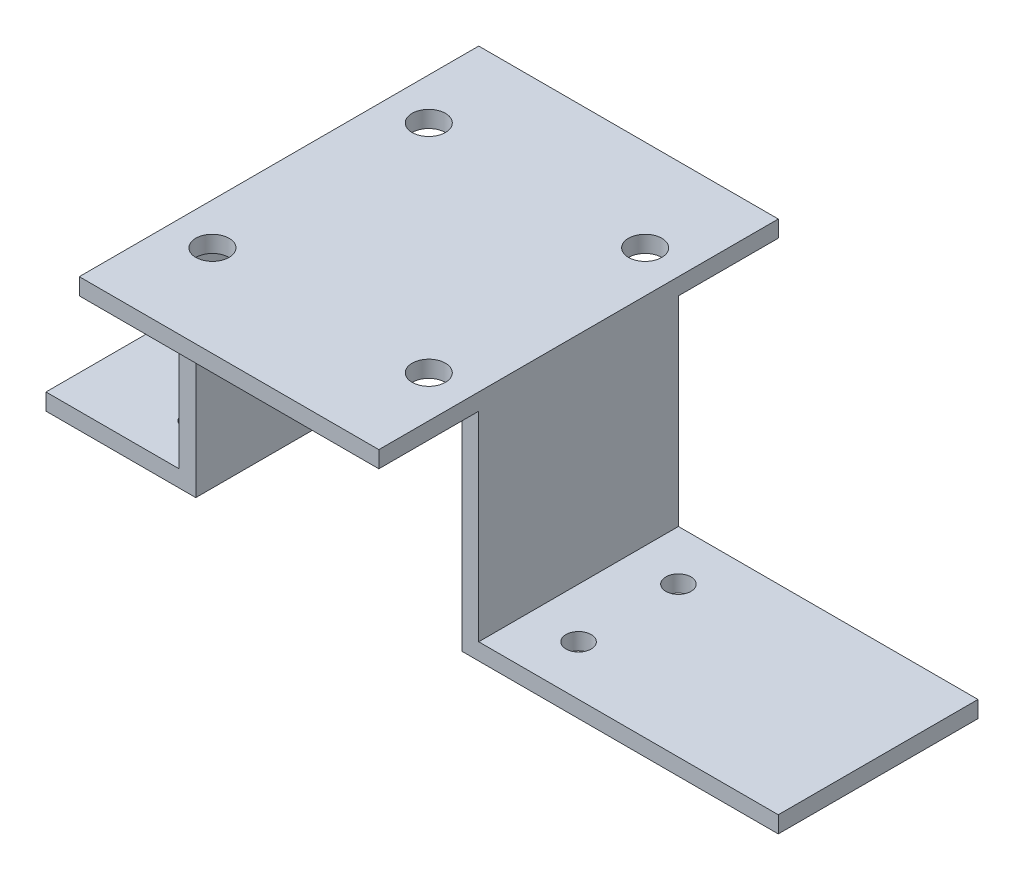
ISO-10303-21;
HEADER;
FILE_DESCRIPTION(('STEP AP214'),'2;1');
FILE_NAME('part.step','',(''),(''),'','','');
FILE_SCHEMA(('AUTOMOTIVE_DESIGN { 1 0 10303 214 1 1 1 1 }'));
ENDSEC;
DATA;
#1=APPLICATION_CONTEXT('core data for automotive mechanical design processes');
#2=APPLICATION_PROTOCOL_DEFINITION('international standard','automotive_design',2000,#1);
#3=PRODUCT_CONTEXT('',#1,'mechanical');
#4=PRODUCT('Part','Part','',(#3));
#5=PRODUCT_RELATED_PRODUCT_CATEGORY('part','',(#4));
#6=PRODUCT_DEFINITION_FORMATION('','',#4);
#7=PRODUCT_DEFINITION_CONTEXT('part definition',#1,'design');
#8=PRODUCT_DEFINITION('design','',#6,#7);
#9=PRODUCT_DEFINITION_SHAPE('','',#8);
#10=(LENGTH_UNIT() NAMED_UNIT(*) SI_UNIT(.MILLI.,.METRE.));
#11=(NAMED_UNIT(*) PLANE_ANGLE_UNIT() SI_UNIT($,.RADIAN.));
#12=(NAMED_UNIT(*) SI_UNIT($,.STERADIAN.) SOLID_ANGLE_UNIT());
#13=UNCERTAINTY_MEASURE_WITH_UNIT(LENGTH_MEASURE(1.E-05),#10,'distance_accuracy_value','');
#14=(GEOMETRIC_REPRESENTATION_CONTEXT(3) GLOBAL_UNCERTAINTY_ASSIGNED_CONTEXT((#13)) GLOBAL_UNIT_ASSIGNED_CONTEXT((#10,
#11,#12)) REPRESENTATION_CONTEXT('',''));
#15=CARTESIAN_POINT('',(0.,0.,0.));
#16=DIRECTION('',(0.,0.,1.));
#17=DIRECTION('',(1.,0.,0.));
#18=AXIS2_PLACEMENT_3D('',#15,#16,#17);
#19=CARTESIAN_POINT('',(19.05,-15.875,28.575));
#20=DIRECTION('',(0.,1.,0.));
#21=DIRECTION('',(-1.,0.,0.));
#22=AXIS2_PLACEMENT_3D('',#19,#20,#21);
#23=CYLINDRICAL_SURFACE('',#22,2.4003);
#24=CARTESIAN_POINT('',(19.05,0.,28.575));
#25=DIRECTION('',(0.,1.,0.));
#26=DIRECTION('',(-1.,0.,0.));
#27=AXIS2_PLACEMENT_3D('',#24,#25,#26);
#28=CIRCLE('',#27,2.4003);
#29=CARTESIAN_POINT('',(16.6497,0.,28.575));
#30=VERTEX_POINT('',#29);
#31=EDGE_CURVE('E19',#30,#30,#28,.F.);
#32=ORIENTED_EDGE('',*,*,#31,.T.);
#33=EDGE_LOOP('',(#32));
#34=FACE_BOUND('',#33,.T.);
#35=CARTESIAN_POINT('',(19.05,3.175,28.575));
#36=DIRECTION('',(0.,1.,0.));
#37=DIRECTION('',(-1.,0.,0.));
#38=AXIS2_PLACEMENT_3D('',#35,#36,#37);
#39=CIRCLE('',#38,2.4003);
#40=CARTESIAN_POINT('',(16.6497,3.175,28.575));
#41=VERTEX_POINT('',#40);
#42=EDGE_CURVE('E147',#41,#41,#39,.T.);
#43=ORIENTED_EDGE('',*,*,#42,.T.);
#44=EDGE_LOOP('',(#43));
#45=FACE_BOUND('',#44,.T.);
#46=ADVANCED_FACE('F16',(#34,#45),#23,.F.);
#47=CARTESIAN_POINT('',(19.05,-15.875,9.525));
#48=DIRECTION('',(0.,1.,0.));
#49=DIRECTION('',(-1.,0.,0.));
#50=AXIS2_PLACEMENT_3D('',#47,#48,#49);
#51=CYLINDRICAL_SURFACE('',#50,2.4003);
#52=CARTESIAN_POINT('',(19.05,0.,9.525));
#53=DIRECTION('',(0.,1.,0.));
#54=DIRECTION('',(-1.,0.,0.));
#55=AXIS2_PLACEMENT_3D('',#52,#53,#54);
#56=CIRCLE('',#55,2.4003);
#57=CARTESIAN_POINT('',(16.6497,0.,9.525));
#58=VERTEX_POINT('',#57);
#59=EDGE_CURVE('E164',#58,#58,#56,.F.);
#60=ORIENTED_EDGE('',*,*,#59,.T.);
#61=EDGE_LOOP('',(#60));
#62=FACE_BOUND('',#61,.T.);
#63=CARTESIAN_POINT('',(19.05,3.175,9.525));
#64=DIRECTION('',(0.,1.,0.));
#65=DIRECTION('',(-1.,0.,0.));
#66=AXIS2_PLACEMENT_3D('',#63,#64,#65);
#67=CIRCLE('',#66,2.4003);
#68=CARTESIAN_POINT('',(16.6497,3.175,9.525));
#69=VERTEX_POINT('',#68);
#70=EDGE_CURVE('E201',#69,#69,#67,.T.);
#71=ORIENTED_EDGE('',*,*,#70,.T.);
#72=EDGE_LOOP('',(#71));
#73=FACE_BOUND('',#72,.T.);
#74=ADVANCED_FACE('F230',(#62,#73),#51,.F.);
#75=CARTESIAN_POINT('',(0.,0.,38.1));
#76=DIRECTION('',(1.,0.,0.));
#77=DIRECTION('',(0.,1.,0.));
#78=AXIS2_PLACEMENT_3D('',#75,#76,#77);
#79=PLANE('',#78);
#80=DIRECTION('',(0.,0.,1.));
#81=VECTOR('',#80,1.);
#82=CARTESIAN_POINT('',(0.,0.,38.1));
#83=LINE('',#82,#81);
#84=CARTESIAN_POINT('',(0.,0.,0.));
#85=VERTEX_POINT('',#84);
#86=CARTESIAN_POINT('',(0.,0.,38.1));
#87=VERTEX_POINT('',#86);
#88=EDGE_CURVE('E142',#85,#87,#83,.T.);
#89=ORIENTED_EDGE('',*,*,#88,.T.);
#90=DIRECTION('',(0.,1.,0.));
#91=VECTOR('',#90,1.);
#92=CARTESIAN_POINT('',(0.,0.,38.1));
#93=LINE('',#92,#91);
#94=CARTESIAN_POINT('',(0.,3.175,38.1));
#95=VERTEX_POINT('',#94);
#96=EDGE_CURVE('E126',#95,#87,#93,.F.);
#97=ORIENTED_EDGE('',*,*,#96,.F.);
#98=DIRECTION('',(0.,0.,1.));
#99=VECTOR('',#98,1.);
#100=CARTESIAN_POINT('',(0.,3.175,38.1));
#101=LINE('',#100,#99);
#102=CARTESIAN_POINT('',(0.,3.175,0.));
#103=VERTEX_POINT('',#102);
#104=EDGE_CURVE('E523',#95,#103,#101,.F.);
#105=ORIENTED_EDGE('',*,*,#104,.T.);
#106=DIRECTION('',(0.,1.,0.));
#107=VECTOR('',#106,1.);
#108=CARTESIAN_POINT('',(0.,0.,0.));
#109=LINE('',#108,#107);
#110=EDGE_CURVE('E517',#103,#85,#109,.F.);
#111=ORIENTED_EDGE('',*,*,#110,.T.);
#112=EDGE_LOOP('',(#89,#97,#105,#111));
#113=FACE_BOUND('',#112,.T.);
#114=ADVANCED_FACE('F220',(#113),#79,.F.);
#115=CARTESIAN_POINT('',(0.,0.,38.1));
#116=DIRECTION('',(0.,1.,0.));
#117=DIRECTION('',(0.,0.,1.));
#118=AXIS2_PLACEMENT_3D('',#115,#116,#117);
#119=PLANE('',#118);
#120=DIRECTION('',(0.,0.,1.));
#121=VECTOR('',#120,1.);
#122=CARTESIAN_POINT('',(28.575,0.,38.1));
#123=LINE('',#122,#121);
#124=CARTESIAN_POINT('',(28.575,0.,0.));
#125=VERTEX_POINT('',#124);
#126=CARTESIAN_POINT('',(28.575,0.,38.1));
#127=VERTEX_POINT('',#126);
#128=EDGE_CURVE('E132',#125,#127,#123,.T.);
#129=ORIENTED_EDGE('',*,*,#128,.T.);
#130=DIRECTION('',(1.,0.,0.));
#131=VECTOR('',#130,1.);
#132=CARTESIAN_POINT('',(0.,0.,38.1));
#133=LINE('',#132,#131);
#134=EDGE_CURVE('E135',#87,#127,#133,.T.);
#135=ORIENTED_EDGE('',*,*,#134,.F.);
#136=ORIENTED_EDGE('',*,*,#88,.F.);
#137=DIRECTION('',(1.,0.,0.));
#138=VECTOR('',#137,1.);
#139=CARTESIAN_POINT('',(0.,0.,0.));
#140=LINE('',#139,#138);
#141=EDGE_CURVE('E137',#85,#125,#140,.T.);
#142=ORIENTED_EDGE('',*,*,#141,.T.);
#143=EDGE_LOOP('',(#129,#135,#136,#142));
#144=FACE_BOUND('',#143,.T.);
#145=ORIENTED_EDGE('',*,*,#59,.F.);
#146=EDGE_LOOP('',(#145));
#147=FACE_BOUND('',#146,.T.);
#148=ORIENTED_EDGE('',*,*,#31,.F.);
#149=EDGE_LOOP('',(#148));
#150=FACE_BOUND('',#149,.T.);
#151=ADVANCED_FACE('F133',(#144,#147,#150),#119,.F.);
#152=CARTESIAN_POINT('',(92.075,-15.875,28.575));
#153=DIRECTION('',(0.,1.,0.));
#154=DIRECTION('',(-1.,0.,0.));
#155=AXIS2_PLACEMENT_3D('',#152,#153,#154);
#156=CYLINDRICAL_SURFACE('',#155,2.40029999999999);
#157=CARTESIAN_POINT('',(92.075,0.,28.575));
#158=DIRECTION('',(0.,1.,0.));
#159=DIRECTION('',(-1.,0.,0.));
#160=AXIS2_PLACEMENT_3D('',#157,#158,#159);
#161=CIRCLE('',#160,2.40029999999999);
#162=CARTESIAN_POINT('',(89.6747,0.,28.575));
#163=VERTEX_POINT('',#162);
#164=EDGE_CURVE('E141',#163,#163,#161,.F.);
#165=ORIENTED_EDGE('',*,*,#164,.T.);
#166=EDGE_LOOP('',(#165));
#167=FACE_BOUND('',#166,.T.);
#168=CARTESIAN_POINT('',(92.075,3.17500000000001,28.575));
#169=DIRECTION('',(0.,1.,0.));
#170=DIRECTION('',(-1.,0.,0.));
#171=AXIS2_PLACEMENT_3D('',#168,#169,#170);
#172=CIRCLE('',#171,2.40029999999999);
#173=CARTESIAN_POINT('',(89.6747,3.17500000000001,28.575));
#174=VERTEX_POINT('',#173);
#175=EDGE_CURVE('E197',#174,#174,#172,.T.);
#176=ORIENTED_EDGE('',*,*,#175,.T.);
#177=EDGE_LOOP('',(#176));
#178=FACE_BOUND('',#177,.T.);
#179=ADVANCED_FACE('F219',(#167,#178),#156,.F.);
#180=CARTESIAN_POINT('',(92.075,-15.875,9.525));
#181=DIRECTION('',(0.,1.,0.));
#182=DIRECTION('',(-1.,0.,0.));
#183=AXIS2_PLACEMENT_3D('',#180,#181,#182);
#184=CYLINDRICAL_SURFACE('',#183,2.40029999999999);
#185=CARTESIAN_POINT('',(92.075,0.,9.525));
#186=DIRECTION('',(0.,1.,0.));
#187=DIRECTION('',(-1.,0.,0.));
#188=AXIS2_PLACEMENT_3D('',#185,#186,#187);
#189=CIRCLE('',#188,2.40029999999999);
#190=CARTESIAN_POINT('',(89.6747,0.,9.525));
#191=VERTEX_POINT('',#190);
#192=EDGE_CURVE('E161',#191,#191,#189,.F.);
#193=ORIENTED_EDGE('',*,*,#192,.T.);
#194=EDGE_LOOP('',(#193));
#195=FACE_BOUND('',#194,.T.);
#196=CARTESIAN_POINT('',(92.075,3.17500000000001,9.525));
#197=DIRECTION('',(0.,1.,0.));
#198=DIRECTION('',(-1.,0.,0.));
#199=AXIS2_PLACEMENT_3D('',#196,#197,#198);
#200=CIRCLE('',#199,2.40029999999999);
#201=CARTESIAN_POINT('',(89.6747,3.17500000000001,9.525));
#202=VERTEX_POINT('',#201);
#203=EDGE_CURVE('E193',#202,#202,#200,.T.);
#204=ORIENTED_EDGE('',*,*,#203,.T.);
#205=EDGE_LOOP('',(#204));
#206=FACE_BOUND('',#205,.T.);
#207=ADVANCED_FACE('F227',(#195,#206),#184,.F.);
#208=CARTESIAN_POINT('',(28.575,0.,38.1));
#209=DIRECTION('',(-1.,0.,0.));
#210=DIRECTION('',(0.,0.,1.));
#211=AXIS2_PLACEMENT_3D('',#208,#209,#210);
#212=PLANE('',#211);
#213=DIRECTION('',(0.,0.,1.));
#214=VECTOR('',#213,1.);
#215=CARTESIAN_POINT('',(28.575,41.275,57.15));
#216=LINE('',#215,#214);
#217=CARTESIAN_POINT('',(28.575,41.275,0.));
#218=VERTEX_POINT('',#217);
#219=CARTESIAN_POINT('',(28.575,41.275,38.1));
#220=VERTEX_POINT('',#219);
#221=EDGE_CURVE('E152',#218,#220,#216,.T.);
#222=ORIENTED_EDGE('',*,*,#221,.T.);
#223=DIRECTION('',(0.,1.,0.));
#224=VECTOR('',#223,1.);
#225=CARTESIAN_POINT('',(28.575,0.,38.1));
#226=LINE('',#225,#224);
#227=EDGE_CURVE('E145',#127,#220,#226,.T.);
#228=ORIENTED_EDGE('',*,*,#227,.F.);
#229=ORIENTED_EDGE('',*,*,#128,.F.);
#230=DIRECTION('',(0.,1.,0.));
#231=VECTOR('',#230,1.);
#232=CARTESIAN_POINT('',(28.575,0.,0.));
#233=LINE('',#232,#231);
#234=EDGE_CURVE('E200',#125,#218,#233,.T.);
#235=ORIENTED_EDGE('',*,*,#234,.T.);
#236=EDGE_LOOP('',(#222,#228,#229,#235));
#237=FACE_BOUND('',#236,.T.);
#238=ADVANCED_FACE('F150',(#237),#212,.F.);
#239=CARTESIAN_POINT('',(79.375,0.,38.1));
#240=DIRECTION('',(1.,0.,0.));
#241=DIRECTION('',(0.,1.,0.));
#242=AXIS2_PLACEMENT_3D('',#239,#240,#241);
#243=PLANE('',#242);
#244=DIRECTION('',(0.,0.,1.));
#245=VECTOR('',#244,1.);
#246=CARTESIAN_POINT('',(79.375,0.,38.1));
#247=LINE('',#246,#245);
#248=CARTESIAN_POINT('',(79.375,0.,0.));
#249=VERTEX_POINT('',#248);
#250=CARTESIAN_POINT('',(79.375,0.,38.1));
#251=VERTEX_POINT('',#250);
#252=EDGE_CURVE('E157',#249,#251,#247,.T.);
#253=ORIENTED_EDGE('',*,*,#252,.T.);
#254=DIRECTION('',(0.,1.,0.));
#255=VECTOR('',#254,1.);
#256=CARTESIAN_POINT('',(79.375,0.,38.1));
#257=LINE('',#256,#255);
#258=CARTESIAN_POINT('',(79.375,41.275,38.1));
#259=VERTEX_POINT('',#258);
#260=EDGE_CURVE('E499',#259,#251,#257,.F.);
#261=ORIENTED_EDGE('',*,*,#260,.F.);
#262=DIRECTION('',(0.,0.,1.));
#263=VECTOR('',#262,1.);
#264=CARTESIAN_POINT('',(79.375,41.275,57.15));
#265=LINE('',#264,#263);
#266=CARTESIAN_POINT('',(79.375,41.275,0.));
#267=VERTEX_POINT('',#266);
#268=EDGE_CURVE('E562',#259,#267,#265,.F.);
#269=ORIENTED_EDGE('',*,*,#268,.T.);
#270=DIRECTION('',(0.,1.,0.));
#271=VECTOR('',#270,1.);
#272=CARTESIAN_POINT('',(79.375,0.,0.));
#273=LINE('',#272,#271);
#274=EDGE_CURVE('E501',#267,#249,#273,.F.);
#275=ORIENTED_EDGE('',*,*,#274,.T.);
#276=EDGE_LOOP('',(#253,#261,#269,#275));
#277=FACE_BOUND('',#276,.T.);
#278=ADVANCED_FACE('F306',(#277),#243,.F.);
#279=CARTESIAN_POINT('',(0.,0.,38.1));
#280=DIRECTION('',(0.,1.,0.));
#281=DIRECTION('',(0.,0.,1.));
#282=AXIS2_PLACEMENT_3D('',#279,#280,#281);
#283=PLANE('',#282);
#284=DIRECTION('',(0.,0.,1.));
#285=VECTOR('',#284,1.);
#286=CARTESIAN_POINT('',(139.7,0.,38.1));
#287=LINE('',#286,#285);
#288=CARTESIAN_POINT('',(139.7,0.,0.));
#289=VERTEX_POINT('',#288);
#290=CARTESIAN_POINT('',(139.7,0.,38.1));
#291=VERTEX_POINT('',#290);
#292=EDGE_CURVE('E153',#289,#291,#287,.T.);
#293=ORIENTED_EDGE('',*,*,#292,.T.);
#294=DIRECTION('',(1.,0.,0.));
#295=VECTOR('',#294,1.);
#296=CARTESIAN_POINT('',(0.,0.,38.1));
#297=LINE('',#296,#295);
#298=EDGE_CURVE('E504',#251,#291,#297,.T.);
#299=ORIENTED_EDGE('',*,*,#298,.F.);
#300=ORIENTED_EDGE('',*,*,#252,.F.);
#301=DIRECTION('',(1.,0.,0.));
#302=VECTOR('',#301,1.);
#303=CARTESIAN_POINT('',(0.,0.,0.));
#304=LINE('',#303,#302);
#305=EDGE_CURVE('E559',#249,#289,#304,.T.);
#306=ORIENTED_EDGE('',*,*,#305,.T.);
#307=EDGE_LOOP('',(#293,#299,#300,#306));
#308=FACE_BOUND('',#307,.T.);
#309=ORIENTED_EDGE('',*,*,#192,.F.);
#310=EDGE_LOOP('',(#309));
#311=FACE_BOUND('',#310,.T.);
#312=ORIENTED_EDGE('',*,*,#164,.F.);
#313=EDGE_LOOP('',(#312));
#314=FACE_BOUND('',#313,.T.);
#315=ADVANCED_FACE('F302',(#308,#311,#314),#283,.F.);
#316=CARTESIAN_POINT('',(139.7,0.,38.1));
#317=DIRECTION('',(-1.,0.,0.));
#318=DIRECTION('',(0.,0.,1.));
#319=AXIS2_PLACEMENT_3D('',#316,#317,#318);
#320=PLANE('',#319);
#321=DIRECTION('',(0.,0.,1.));
#322=VECTOR('',#321,1.);
#323=CARTESIAN_POINT('',(139.7,3.175,38.1));
#324=LINE('',#323,#322);
#325=CARTESIAN_POINT('',(139.7,3.175,0.));
#326=VERTEX_POINT('',#325);
#327=CARTESIAN_POINT('',(139.7,3.175,38.1));
#328=VERTEX_POINT('',#327);
#329=EDGE_CURVE('E196',#326,#328,#324,.T.);
#330=ORIENTED_EDGE('',*,*,#329,.T.);
#331=DIRECTION('',(0.,1.,0.));
#332=VECTOR('',#331,1.);
#333=CARTESIAN_POINT('',(139.7,0.,38.1));
#334=LINE('',#333,#332);
#335=EDGE_CURVE('E506',#291,#328,#334,.T.);
#336=ORIENTED_EDGE('',*,*,#335,.F.);
#337=ORIENTED_EDGE('',*,*,#292,.F.);
#338=DIRECTION('',(0.,1.,0.));
#339=VECTOR('',#338,1.);
#340=CARTESIAN_POINT('',(139.7,0.,0.));
#341=LINE('',#340,#339);
#342=EDGE_CURVE('E556',#289,#326,#341,.T.);
#343=ORIENTED_EDGE('',*,*,#342,.T.);
#344=EDGE_LOOP('',(#330,#336,#337,#343));
#345=FACE_BOUND('',#344,.T.);
#346=ADVANCED_FACE('F299',(#345),#320,.F.);
#347=CARTESIAN_POINT('',(0.,0.,38.1));
#348=DIRECTION('',(0.,0.,1.));
#349=DIRECTION('',(1.,0.,0.));
#350=AXIS2_PLACEMENT_3D('',#347,#348,#349);
#351=PLANE('',#350);
#352=ORIENTED_EDGE('',*,*,#96,.T.);
#353=ORIENTED_EDGE('',*,*,#134,.T.);
#354=ORIENTED_EDGE('',*,*,#227,.T.);
#355=DIRECTION('',(-1.,0.,0.));
#356=VECTOR('',#355,1.);
#357=CARTESIAN_POINT('',(0.,41.275,38.1));
#358=LINE('',#357,#356);
#359=CARTESIAN_POINT('',(25.4,41.275,38.1));
#360=VERTEX_POINT('',#359);
#361=EDGE_CURVE('E567',#220,#360,#358,.T.);
#362=ORIENTED_EDGE('',*,*,#361,.T.);
#363=DIRECTION('',(0.,1.,0.));
#364=VECTOR('',#363,1.);
#365=CARTESIAN_POINT('',(25.4,0.,38.1));
#366=LINE('',#365,#364);
#367=CARTESIAN_POINT('',(25.4,3.175,38.1));
#368=VERTEX_POINT('',#367);
#369=EDGE_CURVE('E527',#360,#368,#366,.F.);
#370=ORIENTED_EDGE('',*,*,#369,.T.);
#371=DIRECTION('',(1.,0.,0.));
#372=VECTOR('',#371,1.);
#373=CARTESIAN_POINT('',(0.,3.175,38.1));
#374=LINE('',#373,#372);
#375=EDGE_CURVE('E204',#368,#95,#374,.F.);
#376=ORIENTED_EDGE('',*,*,#375,.T.);
#377=EDGE_LOOP('',(#352,#353,#354,#362,#370,#376));
#378=FACE_BOUND('',#377,.T.);
#379=ADVANCED_FACE('F144',(#378),#351,.T.);
#380=CARTESIAN_POINT('',(0.,3.175,38.1));
#381=DIRECTION('',(0.,-1.,0.));
#382=DIRECTION('',(1.,0.,0.));
#383=AXIS2_PLACEMENT_3D('',#380,#381,#382);
#384=PLANE('',#383);
#385=ORIENTED_EDGE('',*,*,#104,.F.);
#386=ORIENTED_EDGE('',*,*,#375,.F.);
#387=DIRECTION('',(0.,0.,1.));
#388=VECTOR('',#387,1.);
#389=CARTESIAN_POINT('',(25.4,3.175,38.1));
#390=LINE('',#389,#388);
#391=CARTESIAN_POINT('',(25.4,3.175,0.));
#392=VERTEX_POINT('',#391);
#393=EDGE_CURVE('E531',#368,#392,#390,.F.);
#394=ORIENTED_EDGE('',*,*,#393,.T.);
#395=DIRECTION('',(1.,0.,0.));
#396=VECTOR('',#395,1.);
#397=CARTESIAN_POINT('',(0.,3.175,0.));
#398=LINE('',#397,#396);
#399=EDGE_CURVE('E520',#392,#103,#398,.F.);
#400=ORIENTED_EDGE('',*,*,#399,.T.);
#401=EDGE_LOOP('',(#385,#386,#394,#400));
#402=FACE_BOUND('',#401,.T.);
#403=ORIENTED_EDGE('',*,*,#70,.F.);
#404=EDGE_LOOP('',(#403));
#405=FACE_BOUND('',#404,.T.);
#406=ORIENTED_EDGE('',*,*,#42,.F.);
#407=EDGE_LOOP('',(#406));
#408=FACE_BOUND('',#407,.T.);
#409=ADVANCED_FACE('F292',(#402,#405,#408),#384,.F.);
#410=CARTESIAN_POINT('',(0.,0.,0.));
#411=DIRECTION('',(0.,0.,1.));
#412=DIRECTION('',(1.,0.,0.));
#413=AXIS2_PLACEMENT_3D('',#410,#411,#412);
#414=PLANE('',#413);
#415=ORIENTED_EDGE('',*,*,#234,.F.);
#416=ORIENTED_EDGE('',*,*,#141,.F.);
#417=ORIENTED_EDGE('',*,*,#110,.F.);
#418=ORIENTED_EDGE('',*,*,#399,.F.);
#419=DIRECTION('',(0.,1.,0.));
#420=VECTOR('',#419,1.);
#421=CARTESIAN_POINT('',(25.4,0.,0.));
#422=LINE('',#421,#420);
#423=CARTESIAN_POINT('',(25.4,41.275,0.));
#424=VERTEX_POINT('',#423);
#425=EDGE_CURVE('E538',#392,#424,#422,.T.);
#426=ORIENTED_EDGE('',*,*,#425,.T.);
#427=DIRECTION('',(-1.,0.,0.));
#428=VECTOR('',#427,1.);
#429=CARTESIAN_POINT('',(0.,41.275,0.));
#430=LINE('',#429,#428);
#431=EDGE_CURVE('E570',#424,#218,#430,.F.);
#432=ORIENTED_EDGE('',*,*,#431,.T.);
#433=EDGE_LOOP('',(#415,#416,#417,#418,#426,#432));
#434=FACE_BOUND('',#433,.T.);
#435=ADVANCED_FACE('F288',(#434),#414,.F.);
#436=CARTESIAN_POINT('',(0.,3.17499999999998,38.1));
#437=DIRECTION('',(0.,-1.,0.));
#438=DIRECTION('',(1.,0.,0.));
#439=AXIS2_PLACEMENT_3D('',#436,#437,#438);
#440=PLANE('',#439);
#441=DIRECTION('',(0.,0.,1.));
#442=VECTOR('',#441,1.);
#443=CARTESIAN_POINT('',(82.55,3.17499999999999,57.15));
#444=LINE('',#443,#442);
#445=CARTESIAN_POINT('',(82.55,3.17499999999999,0.));
#446=VERTEX_POINT('',#445);
#447=CARTESIAN_POINT('',(82.55,3.17499999999999,38.1));
#448=VERTEX_POINT('',#447);
#449=EDGE_CURVE('E579',#446,#448,#444,.T.);
#450=ORIENTED_EDGE('',*,*,#449,.T.);
#451=DIRECTION('',(1.,0.,0.));
#452=VECTOR('',#451,1.);
#453=CARTESIAN_POINT('',(0.,3.175,38.1));
#454=LINE('',#453,#452);
#455=EDGE_CURVE('E508',#328,#448,#454,.F.);
#456=ORIENTED_EDGE('',*,*,#455,.F.);
#457=ORIENTED_EDGE('',*,*,#329,.F.);
#458=DIRECTION('',(1.,0.,0.));
#459=VECTOR('',#458,1.);
#460=CARTESIAN_POINT('',(0.,3.175,0.));
#461=LINE('',#460,#459);
#462=EDGE_CURVE('E553',#326,#446,#461,.F.);
#463=ORIENTED_EDGE('',*,*,#462,.T.);
#464=EDGE_LOOP('',(#450,#456,#457,#463));
#465=FACE_BOUND('',#464,.T.);
#466=ORIENTED_EDGE('',*,*,#203,.F.);
#467=EDGE_LOOP('',(#466));
#468=FACE_BOUND('',#467,.T.);
#469=ORIENTED_EDGE('',*,*,#175,.F.);
#470=EDGE_LOOP('',(#469));
#471=FACE_BOUND('',#470,.T.);
#472=ADVANCED_FACE('F284',(#465,#468,#471),#440,.F.);
#473=CARTESIAN_POINT('',(0.,0.,38.1));
#474=DIRECTION('',(0.,0.,1.));
#475=DIRECTION('',(1.,0.,0.));
#476=AXIS2_PLACEMENT_3D('',#473,#474,#475);
#477=PLANE('',#476);
#478=ORIENTED_EDGE('',*,*,#455,.T.);
#479=DIRECTION('',(0.,-1.,0.));
#480=VECTOR('',#479,1.);
#481=CARTESIAN_POINT('',(82.55,0.,38.1));
#482=LINE('',#481,#480);
#483=CARTESIAN_POINT('',(82.55,41.275,38.1));
#484=VERTEX_POINT('',#483);
#485=EDGE_CURVE('E575',#448,#484,#482,.F.);
#486=ORIENTED_EDGE('',*,*,#485,.T.);
#487=DIRECTION('',(-1.,0.,0.));
#488=VECTOR('',#487,1.);
#489=CARTESIAN_POINT('',(0.,41.275,38.1));
#490=LINE('',#489,#488);
#491=EDGE_CURVE('E564',#484,#259,#490,.T.);
#492=ORIENTED_EDGE('',*,*,#491,.T.);
#493=ORIENTED_EDGE('',*,*,#260,.T.);
#494=ORIENTED_EDGE('',*,*,#298,.T.);
#495=ORIENTED_EDGE('',*,*,#335,.T.);
#496=EDGE_LOOP('',(#478,#486,#492,#493,#494,#495));
#497=FACE_BOUND('',#496,.T.);
#498=ADVANCED_FACE('F280',(#497),#477,.T.);
#499=CARTESIAN_POINT('',(0.,41.275,57.15));
#500=DIRECTION('',(0.,1.,0.));
#501=DIRECTION('',(-1.,0.,0.));
#502=AXIS2_PLACEMENT_3D('',#499,#500,#501);
#503=PLANE('',#502);
#504=ORIENTED_EDGE('',*,*,#491,.F.);
#505=DIRECTION('',(0.,0.,1.));
#506=VECTOR('',#505,1.);
#507=CARTESIAN_POINT('',(82.55,41.275,57.15));
#508=LINE('',#507,#506);
#509=CARTESIAN_POINT('',(82.55,41.275,57.15));
#510=VERTEX_POINT('',#509);
#511=EDGE_CURVE('E582',#484,#510,#508,.T.);
#512=ORIENTED_EDGE('',*,*,#511,.T.);
#513=DIRECTION('',(1.,0.,0.));
#514=VECTOR('',#513,1.);
#515=CARTESIAN_POINT('',(0.,41.275,57.15));
#516=LINE('',#515,#514);
#517=CARTESIAN_POINT('',(25.4,41.275,57.15));
#518=VERTEX_POINT('',#517);
#519=EDGE_CURVE('E182',#518,#510,#516,.T.);
#520=ORIENTED_EDGE('',*,*,#519,.F.);
#521=DIRECTION('',(0.,0.,1.));
#522=VECTOR('',#521,1.);
#523=CARTESIAN_POINT('',(25.4,41.275,38.1));
#524=LINE('',#523,#522);
#525=EDGE_CURVE('E542',#518,#360,#524,.F.);
#526=ORIENTED_EDGE('',*,*,#525,.T.);
#527=ORIENTED_EDGE('',*,*,#361,.F.);
#528=ORIENTED_EDGE('',*,*,#221,.F.);
#529=ORIENTED_EDGE('',*,*,#431,.F.);
#530=DIRECTION('',(0.,0.,1.));
#531=VECTOR('',#530,1.);
#532=CARTESIAN_POINT('',(25.4,41.275,38.1));
#533=LINE('',#532,#531);
#534=CARTESIAN_POINT('',(25.4,41.275,-19.05));
#535=VERTEX_POINT('',#534);
#536=EDGE_CURVE('E540',#424,#535,#533,.F.);
#537=ORIENTED_EDGE('',*,*,#536,.T.);
#538=DIRECTION('',(-1.,0.,0.));
#539=VECTOR('',#538,1.);
#540=CARTESIAN_POINT('',(0.,41.275,-19.05));
#541=LINE('',#540,#539);
#542=CARTESIAN_POINT('',(82.55,41.275,-19.05));
#543=VERTEX_POINT('',#542);
#544=EDGE_CURVE('E588',#543,#535,#541,.T.);
#545=ORIENTED_EDGE('',*,*,#544,.F.);
#546=DIRECTION('',(0.,0.,1.));
#547=VECTOR('',#546,1.);
#548=CARTESIAN_POINT('',(82.55,41.275,57.15));
#549=LINE('',#548,#547);
#550=CARTESIAN_POINT('',(82.55,41.275,0.));
#551=VERTEX_POINT('',#550);
#552=EDGE_CURVE('E605',#543,#551,#549,.T.);
#553=ORIENTED_EDGE('',*,*,#552,.T.);
#554=DIRECTION('',(1.,0.,0.));
#555=VECTOR('',#554,1.);
#556=CARTESIAN_POINT('',(0.,41.275,0.));
#557=LINE('',#556,#555);
#558=EDGE_CURVE('E192',#551,#267,#557,.F.);
#559=ORIENTED_EDGE('',*,*,#558,.T.);
#560=ORIENTED_EDGE('',*,*,#268,.F.);
#561=EDGE_LOOP('',(#504,#512,#520,#526,#527,#528,#529,#537,#545,#553,#559,#560));
#562=FACE_BOUND('',#561,.T.);
#563=CARTESIAN_POINT('',(74.6125,41.275,39.6875));
#564=DIRECTION('',(0.,1.,0.));
#565=DIRECTION('',(-1.,0.,0.));
#566=AXIS2_PLACEMENT_3D('',#563,#564,#565);
#567=CIRCLE('',#566,3.175);
#568=CARTESIAN_POINT('',(71.4375,41.275,39.6875));
#569=VERTEX_POINT('',#568);
#570=EDGE_CURVE('E179',#569,#569,#567,.T.);
#571=ORIENTED_EDGE('',*,*,#570,.T.);
#572=EDGE_LOOP('',(#571));
#573=FACE_BOUND('',#572,.T.);
#574=CARTESIAN_POINT('',(33.3375,41.275,39.6875));
#575=DIRECTION('',(0.,1.,0.));
#576=DIRECTION('',(-1.,0.,0.));
#577=AXIS2_PLACEMENT_3D('',#574,#575,#576);
#578=CIRCLE('',#577,3.175);
#579=CARTESIAN_POINT('',(30.1625,41.275,39.6875));
#580=VERTEX_POINT('',#579);
#581=EDGE_CURVE('E183',#580,#580,#578,.T.);
#582=ORIENTED_EDGE('',*,*,#581,.T.);
#583=EDGE_LOOP('',(#582));
#584=FACE_BOUND('',#583,.T.);
#585=CARTESIAN_POINT('',(33.3375,41.275,-1.5875));
#586=DIRECTION('',(0.,1.,0.));
#587=DIRECTION('',(-1.,0.,0.));
#588=AXIS2_PLACEMENT_3D('',#585,#586,#587);
#589=CIRCLE('',#588,3.175);
#590=CARTESIAN_POINT('',(30.1625,41.275,-1.5875));
#591=VERTEX_POINT('',#590);
#592=EDGE_CURVE('E186',#591,#591,#589,.T.);
#593=ORIENTED_EDGE('',*,*,#592,.T.);
#594=EDGE_LOOP('',(#593));
#595=FACE_BOUND('',#594,.T.);
#596=CARTESIAN_POINT('',(74.6125,41.275,-1.5875));
#597=DIRECTION('',(0.,1.,0.));
#598=DIRECTION('',(-1.,0.,0.));
#599=AXIS2_PLACEMENT_3D('',#596,#597,#598);
#600=CIRCLE('',#599,3.175);
#601=CARTESIAN_POINT('',(71.4375,41.275,-1.5875));
#602=VERTEX_POINT('',#601);
#603=EDGE_CURVE('E189',#602,#602,#600,.T.);
#604=ORIENTED_EDGE('',*,*,#603,.T.);
#605=EDGE_LOOP('',(#604));
#606=FACE_BOUND('',#605,.T.);
#607=ADVANCED_FACE('F276',(#562,#573,#584,#595,#606),#503,.F.);
#608=CARTESIAN_POINT('',(0.,0.,0.));
#609=DIRECTION('',(0.,0.,1.));
#610=DIRECTION('',(1.,0.,0.));
#611=AXIS2_PLACEMENT_3D('',#608,#609,#610);
#612=PLANE('',#611);
#613=DIRECTION('',(0.,-1.,0.));
#614=VECTOR('',#613,1.);
#615=CARTESIAN_POINT('',(82.55,0.,0.));
#616=LINE('',#615,#614);
#617=EDGE_CURVE('E178',#551,#446,#616,.T.);
#618=ORIENTED_EDGE('',*,*,#617,.T.);
#619=ORIENTED_EDGE('',*,*,#462,.F.);
#620=ORIENTED_EDGE('',*,*,#342,.F.);
#621=ORIENTED_EDGE('',*,*,#305,.F.);
#622=ORIENTED_EDGE('',*,*,#274,.F.);
#623=ORIENTED_EDGE('',*,*,#558,.F.);
#624=EDGE_LOOP('',(#618,#619,#620,#621,#622,#623));
#625=FACE_BOUND('',#624,.T.);
#626=ADVANCED_FACE('F272',(#625),#612,.F.);
#627=CARTESIAN_POINT('',(74.6125,25.4,-1.5875));
#628=DIRECTION('',(0.,1.,0.));
#629=DIRECTION('',(-1.,0.,0.));
#630=AXIS2_PLACEMENT_3D('',#627,#628,#629);
#631=CYLINDRICAL_SURFACE('',#630,3.175);
#632=ORIENTED_EDGE('',*,*,#603,.F.);
#633=EDGE_LOOP('',(#632));
#634=FACE_BOUND('',#633,.T.);
#635=CARTESIAN_POINT('',(74.6125,44.45,-1.5875));
#636=DIRECTION('',(0.,1.,0.));
#637=DIRECTION('',(-1.,0.,0.));
#638=AXIS2_PLACEMENT_3D('',#635,#636,#637);
#639=CIRCLE('',#638,3.175);
#640=CARTESIAN_POINT('',(71.4375,44.45,-1.5875));
#641=VERTEX_POINT('',#640);
#642=EDGE_CURVE('E175',#641,#641,#639,.T.);
#643=ORIENTED_EDGE('',*,*,#642,.T.);
#644=EDGE_LOOP('',(#643));
#645=FACE_BOUND('',#644,.T.);
#646=ADVANCED_FACE('F268',(#634,#645),#631,.F.);
#647=CARTESIAN_POINT('',(33.3375,25.4,-1.5875));
#648=DIRECTION('',(0.,1.,0.));
#649=DIRECTION('',(-1.,0.,0.));
#650=AXIS2_PLACEMENT_3D('',#647,#648,#649);
#651=CYLINDRICAL_SURFACE('',#650,3.175);
#652=ORIENTED_EDGE('',*,*,#592,.F.);
#653=EDGE_LOOP('',(#652));
#654=FACE_BOUND('',#653,.T.);
#655=CARTESIAN_POINT('',(33.3375,44.45,-1.5875));
#656=DIRECTION('',(0.,1.,0.));
#657=DIRECTION('',(-1.,0.,0.));
#658=AXIS2_PLACEMENT_3D('',#655,#656,#657);
#659=CIRCLE('',#658,3.175);
#660=CARTESIAN_POINT('',(30.1625,44.45,-1.5875));
#661=VERTEX_POINT('',#660);
#662=EDGE_CURVE('E172',#661,#661,#659,.T.);
#663=ORIENTED_EDGE('',*,*,#662,.T.);
#664=EDGE_LOOP('',(#663));
#665=FACE_BOUND('',#664,.T.);
#666=ADVANCED_FACE('F264',(#654,#665),#651,.F.);
#667=CARTESIAN_POINT('',(33.3375,25.4,39.6875));
#668=DIRECTION('',(0.,1.,0.));
#669=DIRECTION('',(-1.,0.,0.));
#670=AXIS2_PLACEMENT_3D('',#667,#668,#669);
#671=CYLINDRICAL_SURFACE('',#670,3.175);
#672=ORIENTED_EDGE('',*,*,#581,.F.);
#673=EDGE_LOOP('',(#672));
#674=FACE_BOUND('',#673,.T.);
#675=CARTESIAN_POINT('',(33.3375,44.45,39.6875));
#676=DIRECTION('',(0.,1.,0.));
#677=DIRECTION('',(-1.,0.,0.));
#678=AXIS2_PLACEMENT_3D('',#675,#676,#677);
#679=CIRCLE('',#678,3.175);
#680=CARTESIAN_POINT('',(30.1625,44.45,39.6875));
#681=VERTEX_POINT('',#680);
#682=EDGE_CURVE('E169',#681,#681,#679,.T.);
#683=ORIENTED_EDGE('',*,*,#682,.T.);
#684=EDGE_LOOP('',(#683));
#685=FACE_BOUND('',#684,.T.);
#686=ADVANCED_FACE('F260',(#674,#685),#671,.F.);
#687=CARTESIAN_POINT('',(74.6125,25.4,39.6875));
#688=DIRECTION('',(0.,1.,0.));
#689=DIRECTION('',(-1.,0.,0.));
#690=AXIS2_PLACEMENT_3D('',#687,#688,#689);
#691=CYLINDRICAL_SURFACE('',#690,3.175);
#692=ORIENTED_EDGE('',*,*,#570,.F.);
#693=EDGE_LOOP('',(#692));
#694=FACE_BOUND('',#693,.T.);
#695=CARTESIAN_POINT('',(74.6125,44.45,39.6875));
#696=DIRECTION('',(0.,1.,0.));
#697=DIRECTION('',(-1.,0.,0.));
#698=AXIS2_PLACEMENT_3D('',#695,#696,#697);
#699=CIRCLE('',#698,3.175);
#700=CARTESIAN_POINT('',(71.4375,44.45,39.6875));
#701=VERTEX_POINT('',#700);
#702=EDGE_CURVE('E165',#701,#701,#699,.T.);
#703=ORIENTED_EDGE('',*,*,#702,.T.);
#704=EDGE_LOOP('',(#703));
#705=FACE_BOUND('',#704,.T.);
#706=ADVANCED_FACE('F256',(#694,#705),#691,.F.);
#707=CARTESIAN_POINT('',(0.,0.,57.15));
#708=DIRECTION('',(0.,0.,1.));
#709=DIRECTION('',(1.,0.,0.));
#710=AXIS2_PLACEMENT_3D('',#707,#708,#709);
#711=PLANE('',#710);
#712=DIRECTION('',(1.,0.,0.));
#713=VECTOR('',#712,1.);
#714=CARTESIAN_POINT('',(0.,44.45,57.15));
#715=LINE('',#714,#713);
#716=CARTESIAN_POINT('',(82.55,44.45,57.15));
#717=VERTEX_POINT('',#716);
#718=CARTESIAN_POINT('',(25.4,44.45,57.15));
#719=VERTEX_POINT('',#718);
#720=EDGE_CURVE('E168',#717,#719,#715,.F.);
#721=ORIENTED_EDGE('',*,*,#720,.T.);
#722=DIRECTION('',(0.,1.,0.));
#723=VECTOR('',#722,1.);
#724=CARTESIAN_POINT('',(25.4,0.,57.15));
#725=LINE('',#724,#723);
#726=EDGE_CURVE('E547',#719,#518,#725,.F.);
#727=ORIENTED_EDGE('',*,*,#726,.T.);
#728=ORIENTED_EDGE('',*,*,#519,.T.);
#729=DIRECTION('',(0.,-1.,0.));
#730=VECTOR('',#729,1.);
#731=CARTESIAN_POINT('',(82.55,0.,57.15));
#732=LINE('',#731,#730);
#733=EDGE_CURVE('E608',#510,#717,#732,.F.);
#734=ORIENTED_EDGE('',*,*,#733,.T.);
#735=EDGE_LOOP('',(#721,#727,#728,#734));
#736=FACE_BOUND('',#735,.T.);
#737=ADVANCED_FACE('F252',(#736),#711,.T.);
#738=CARTESIAN_POINT('',(25.4,0.,38.1));
#739=DIRECTION('',(1.,0.,0.));
#740=DIRECTION('',(0.,1.,0.));
#741=AXIS2_PLACEMENT_3D('',#738,#739,#740);
#742=PLANE('',#741);
#743=DIRECTION('',(0.,1.,0.));
#744=VECTOR('',#743,1.);
#745=CARTESIAN_POINT('',(25.4,0.,-19.05));
#746=LINE('',#745,#744);
#747=CARTESIAN_POINT('',(25.4,44.45,-19.05));
#748=VERTEX_POINT('',#747);
#749=EDGE_CURVE('E586',#535,#748,#746,.T.);
#750=ORIENTED_EDGE('',*,*,#749,.F.);
#751=ORIENTED_EDGE('',*,*,#536,.F.);
#752=ORIENTED_EDGE('',*,*,#425,.F.);
#753=ORIENTED_EDGE('',*,*,#393,.F.);
#754=ORIENTED_EDGE('',*,*,#369,.F.);
#755=ORIENTED_EDGE('',*,*,#525,.F.);
#756=ORIENTED_EDGE('',*,*,#726,.F.);
#757=DIRECTION('',(0.,0.,1.));
#758=VECTOR('',#757,1.);
#759=CARTESIAN_POINT('',(25.4,44.45,57.15));
#760=LINE('',#759,#758);
#761=EDGE_CURVE('E597',#719,#748,#760,.F.);
#762=ORIENTED_EDGE('',*,*,#761,.T.);
#763=EDGE_LOOP('',(#750,#751,#752,#753,#754,#755,#756,#762));
#764=FACE_BOUND('',#763,.T.);
#765=ADVANCED_FACE('F248',(#764),#742,.F.);
#766=CARTESIAN_POINT('',(0.,0.,-19.05));
#767=DIRECTION('',(0.,0.,-1.));
#768=DIRECTION('',(-1.,0.,0.));
#769=AXIS2_PLACEMENT_3D('',#766,#767,#768);
#770=PLANE('',#769);
#771=ORIENTED_EDGE('',*,*,#749,.T.);
#772=DIRECTION('',(1.,0.,0.));
#773=VECTOR('',#772,1.);
#774=CARTESIAN_POINT('',(0.,44.45,-19.05));
#775=LINE('',#774,#773);
#776=CARTESIAN_POINT('',(82.55,44.45,-19.05));
#777=VERTEX_POINT('',#776);
#778=EDGE_CURVE('E25',#748,#777,#775,.T.);
#779=ORIENTED_EDGE('',*,*,#778,.T.);
#780=DIRECTION('',(0.,-1.,0.));
#781=VECTOR('',#780,1.);
#782=CARTESIAN_POINT('',(82.55,0.,-19.05));
#783=LINE('',#782,#781);
#784=EDGE_CURVE('E33',#777,#543,#783,.T.);
#785=ORIENTED_EDGE('',*,*,#784,.T.);
#786=ORIENTED_EDGE('',*,*,#544,.T.);
#787=EDGE_LOOP('',(#771,#779,#785,#786));
#788=FACE_BOUND('',#787,.T.);
#789=ADVANCED_FACE('F241',(#788),#770,.T.);
#790=CARTESIAN_POINT('',(82.55,0.,57.15));
#791=DIRECTION('',(-1.,0.,0.));
#792=DIRECTION('',(0.,-1.,0.));
#793=AXIS2_PLACEMENT_3D('',#790,#791,#792);
#794=PLANE('',#793);
#795=ORIENTED_EDGE('',*,*,#552,.F.);
#796=ORIENTED_EDGE('',*,*,#784,.F.);
#797=DIRECTION('',(0.,0.,1.));
#798=VECTOR('',#797,1.);
#799=CARTESIAN_POINT('',(82.55,44.45,57.15));
#800=LINE('',#799,#798);
#801=EDGE_CURVE('E11',#777,#717,#800,.T.);
#802=ORIENTED_EDGE('',*,*,#801,.T.);
#803=ORIENTED_EDGE('',*,*,#733,.F.);
#804=ORIENTED_EDGE('',*,*,#511,.F.);
#805=ORIENTED_EDGE('',*,*,#485,.F.);
#806=ORIENTED_EDGE('',*,*,#449,.F.);
#807=ORIENTED_EDGE('',*,*,#617,.F.);
#808=EDGE_LOOP('',(#795,#796,#802,#803,#804,#805,#806,#807));
#809=FACE_BOUND('',#808,.T.);
#810=ADVANCED_FACE('F235',(#809),#794,.F.);
#811=CARTESIAN_POINT('',(0.,44.45,57.15));
#812=DIRECTION('',(0.,-1.,0.));
#813=DIRECTION('',(1.,0.,0.));
#814=AXIS2_PLACEMENT_3D('',#811,#812,#813);
#815=PLANE('',#814);
#816=ORIENTED_EDGE('',*,*,#778,.F.);
#817=ORIENTED_EDGE('',*,*,#761,.F.);
#818=ORIENTED_EDGE('',*,*,#720,.F.);
#819=ORIENTED_EDGE('',*,*,#801,.F.);
#820=EDGE_LOOP('',(#816,#817,#818,#819));
#821=FACE_BOUND('',#820,.T.);
#822=ORIENTED_EDGE('',*,*,#702,.F.);
#823=EDGE_LOOP('',(#822));
#824=FACE_BOUND('',#823,.T.);
#825=ORIENTED_EDGE('',*,*,#682,.F.);
#826=EDGE_LOOP('',(#825));
#827=FACE_BOUND('',#826,.T.);
#828=ORIENTED_EDGE('',*,*,#662,.F.);
#829=EDGE_LOOP('',(#828));
#830=FACE_BOUND('',#829,.T.);
#831=ORIENTED_EDGE('',*,*,#642,.F.);
#832=EDGE_LOOP('',(#831));
#833=FACE_BOUND('',#832,.T.);
#834=ADVANCED_FACE('F233',(#821,#824,#827,#830,#833),#815,.F.);
#835=CLOSED_SHELL('',(#46,#74,#114,#151,#179,#207,#238,#278,#315,#346,#379,#409,#435,#472,#498,
#607,#626,#646,#666,#686,#706,#737,#765,#789,#810,#834));
#836=MANIFOLD_SOLID_BREP('B1',#835);
#837=ADVANCED_BREP_SHAPE_REPRESENTATION('',(#18,#836),#14);
#838=SHAPE_DEFINITION_REPRESENTATION(#9,#837);
ENDSEC;
END-ISO-10303-21;
